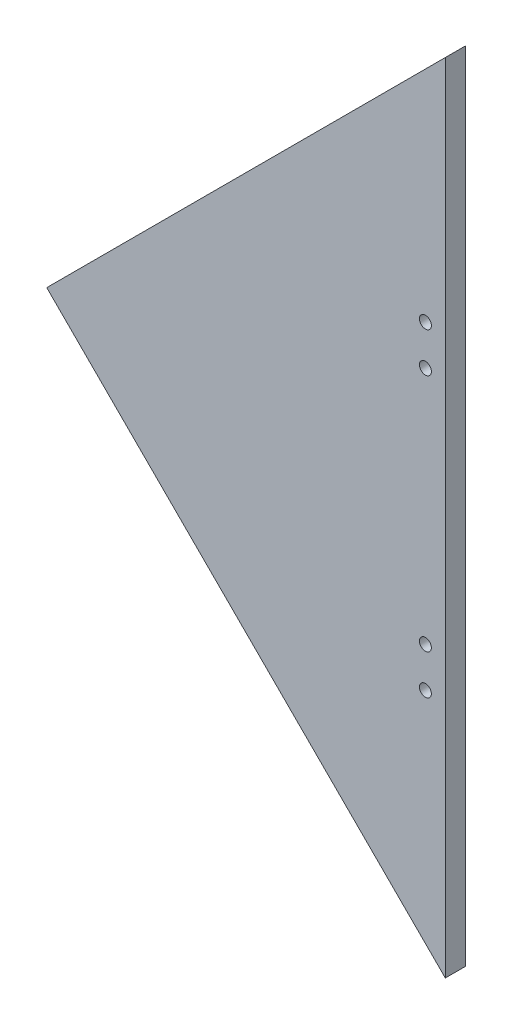
ISO-10303-21;
HEADER;
FILE_DESCRIPTION(('STEP AP214'),'2;1');
FILE_NAME('part.step','',(''),(''),'','','');
FILE_SCHEMA(('AUTOMOTIVE_DESIGN { 1 0 10303 214 1 1 1 1 }'));
ENDSEC;
DATA;
#1=APPLICATION_CONTEXT('core data for automotive mechanical design processes');
#2=APPLICATION_PROTOCOL_DEFINITION('international standard','automotive_design',2000,#1);
#3=PRODUCT_CONTEXT('',#1,'mechanical');
#4=PRODUCT('Part','Part','',(#3));
#5=PRODUCT_RELATED_PRODUCT_CATEGORY('part','',(#4));
#6=PRODUCT_DEFINITION_FORMATION('','',#4);
#7=PRODUCT_DEFINITION_CONTEXT('part definition',#1,'design');
#8=PRODUCT_DEFINITION('design','',#6,#7);
#9=PRODUCT_DEFINITION_SHAPE('','',#8);
#10=(LENGTH_UNIT() NAMED_UNIT(*) SI_UNIT(.MILLI.,.METRE.));
#11=(NAMED_UNIT(*) PLANE_ANGLE_UNIT() SI_UNIT($,.RADIAN.));
#12=(NAMED_UNIT(*) SI_UNIT($,.STERADIAN.) SOLID_ANGLE_UNIT());
#13=UNCERTAINTY_MEASURE_WITH_UNIT(LENGTH_MEASURE(1.E-05),#10,'distance_accuracy_value','');
#14=(GEOMETRIC_REPRESENTATION_CONTEXT(3) GLOBAL_UNCERTAINTY_ASSIGNED_CONTEXT((#13)) GLOBAL_UNIT_ASSIGNED_CONTEXT((#10,
#11,#12)) REPRESENTATION_CONTEXT('',''));
#15=CARTESIAN_POINT('',(0.,0.,0.));
#16=DIRECTION('',(0.,0.,1.));
#17=DIRECTION('',(1.,0.,0.));
#18=AXIS2_PLACEMENT_3D('',#15,#16,#17);
#19=CARTESIAN_POINT('',(0.,0.,5.));
#20=DIRECTION('',(0.,0.,-1.));
#21=DIRECTION('',(-1.,0.,0.));
#22=AXIS2_PLACEMENT_3D('',#19,#20,#21);
#23=PLANE('',#22);
#24=DIRECTION('',(0.707106781186547,-0.707106781186547,0.));
#25=VECTOR('',#24,1.);
#26=CARTESIAN_POINT('',(-100.,0.,5.));
#27=LINE('',#26,#25);
#28=CARTESIAN_POINT('',(-100.,0.,5.));
#29=VERTEX_POINT('',#28);
#30=CARTESIAN_POINT('',(0.,-100.,5.));
#31=VERTEX_POINT('',#30);
#32=EDGE_CURVE('E80',#29,#31,#27,.T.);
#33=ORIENTED_EDGE('',*,*,#32,.T.);
#34=DIRECTION('',(0.,1.,0.));
#35=VECTOR('',#34,1.);
#36=CARTESIAN_POINT('',(0.,-100.,5.));
#37=LINE('',#36,#35);
#38=CARTESIAN_POINT('',(0.,100.,5.));
#39=VERTEX_POINT('',#38);
#40=EDGE_CURVE('E76',#31,#39,#37,.T.);
#41=ORIENTED_EDGE('',*,*,#40,.T.);
#42=DIRECTION('',(-0.707106781186547,-0.707106781186548,0.));
#43=VECTOR('',#42,1.);
#44=CARTESIAN_POINT('',(0.,100.,5.));
#45=LINE('',#44,#43);
#46=EDGE_CURVE('E56',#39,#29,#45,.T.);
#47=ORIENTED_EDGE('',*,*,#46,.T.);
#48=EDGE_LOOP('',(#33,#41,#47));
#49=FACE_BOUND('',#48,.T.);
#50=CARTESIAN_POINT('',(-4.99999999999999,40.,5.));
#51=DIRECTION('',(0.,0.,1.));
#52=DIRECTION('',(1.,0.,0.));
#53=AXIS2_PLACEMENT_3D('',#50,#51,#52);
#54=CIRCLE('',#53,1.5);
#55=CARTESIAN_POINT('',(-3.49999999999999,40.,5.));
#56=VERTEX_POINT('',#55);
#57=EDGE_CURVE('E90',#56,#56,#54,.T.);
#58=ORIENTED_EDGE('',*,*,#57,.F.);
#59=EDGE_LOOP('',(#58));
#60=FACE_BOUND('',#59,.T.);
#61=CARTESIAN_POINT('',(-4.99999999999999,30.,5.));
#62=DIRECTION('',(0.,0.,1.));
#63=DIRECTION('',(1.,0.,0.));
#64=AXIS2_PLACEMENT_3D('',#61,#62,#63);
#65=CIRCLE('',#64,1.5);
#66=CARTESIAN_POINT('',(-3.49999999999999,30.,5.));
#67=VERTEX_POINT('',#66);
#68=EDGE_CURVE('E124',#67,#67,#65,.T.);
#69=ORIENTED_EDGE('',*,*,#68,.F.);
#70=EDGE_LOOP('',(#69));
#71=FACE_BOUND('',#70,.T.);
#72=CARTESIAN_POINT('',(-4.99999999999999,-30.,5.));
#73=DIRECTION('',(0.,0.,1.));
#74=DIRECTION('',(1.,0.,0.));
#75=AXIS2_PLACEMENT_3D('',#72,#73,#74);
#76=CIRCLE('',#75,1.5);
#77=CARTESIAN_POINT('',(-3.49999999999998,-30.,5.));
#78=VERTEX_POINT('',#77);
#79=EDGE_CURVE('E119',#78,#78,#76,.T.);
#80=ORIENTED_EDGE('',*,*,#79,.F.);
#81=EDGE_LOOP('',(#80));
#82=FACE_BOUND('',#81,.T.);
#83=CARTESIAN_POINT('',(-4.99999999999998,-40.,5.));
#84=DIRECTION('',(0.,0.,1.));
#85=DIRECTION('',(1.,0.,0.));
#86=AXIS2_PLACEMENT_3D('',#83,#84,#85);
#87=CIRCLE('',#86,1.5);
#88=CARTESIAN_POINT('',(-3.49999999999998,-40.,5.));
#89=VERTEX_POINT('',#88);
#90=EDGE_CURVE('E113',#89,#89,#87,.T.);
#91=ORIENTED_EDGE('',*,*,#90,.F.);
#92=EDGE_LOOP('',(#91));
#93=FACE_BOUND('',#92,.T.);
#94=ADVANCED_FACE('F39',(#49,#60,#71,#82,#93),#23,.F.);
#95=CARTESIAN_POINT('',(0.,0.,0.));
#96=DIRECTION('',(0.,0.,-1.));
#97=DIRECTION('',(-1.,0.,0.));
#98=AXIS2_PLACEMENT_3D('',#95,#96,#97);
#99=PLANE('',#98);
#100=CARTESIAN_POINT('',(-4.99999999999999,-30.,0.));
#101=DIRECTION('',(0.,0.,1.));
#102=DIRECTION('',(1.,0.,0.));
#103=AXIS2_PLACEMENT_3D('',#100,#101,#102);
#104=CIRCLE('',#103,1.5);
#105=CARTESIAN_POINT('',(-3.49999999999998,-30.,0.));
#106=VERTEX_POINT('',#105);
#107=EDGE_CURVE('E116',#106,#106,#104,.T.);
#108=ORIENTED_EDGE('',*,*,#107,.T.);
#109=EDGE_LOOP('',(#108));
#110=FACE_BOUND('',#109,.T.);
#111=CARTESIAN_POINT('',(-4.99999999999999,40.,0.));
#112=DIRECTION('',(0.,0.,1.));
#113=DIRECTION('',(1.,0.,0.));
#114=AXIS2_PLACEMENT_3D('',#111,#112,#113);
#115=CIRCLE('',#114,1.5);
#116=CARTESIAN_POINT('',(-3.49999999999999,40.,0.));
#117=VERTEX_POINT('',#116);
#118=EDGE_CURVE('E94',#117,#117,#115,.T.);
#119=ORIENTED_EDGE('',*,*,#118,.T.);
#120=EDGE_LOOP('',(#119));
#121=FACE_BOUND('',#120,.T.);
#122=DIRECTION('',(0.707106781186547,-0.707106781186547,0.));
#123=VECTOR('',#122,1.);
#124=CARTESIAN_POINT('',(-100.,0.,0.));
#125=LINE('',#124,#123);
#126=CARTESIAN_POINT('',(-100.,0.,0.));
#127=VERTEX_POINT('',#126);
#128=CARTESIAN_POINT('',(0.,-100.,0.));
#129=VERTEX_POINT('',#128);
#130=EDGE_CURVE('E87',#127,#129,#125,.T.);
#131=ORIENTED_EDGE('',*,*,#130,.F.);
#132=DIRECTION('',(-0.707106781186547,-0.707106781186548,0.));
#133=VECTOR('',#132,1.);
#134=CARTESIAN_POINT('',(0.,100.,0.));
#135=LINE('',#134,#133);
#136=CARTESIAN_POINT('',(0.,100.,0.));
#137=VERTEX_POINT('',#136);
#138=EDGE_CURVE('E73',#137,#127,#135,.T.);
#139=ORIENTED_EDGE('',*,*,#138,.F.);
#140=DIRECTION('',(0.,1.,0.));
#141=VECTOR('',#140,1.);
#142=CARTESIAN_POINT('',(0.,-100.,0.));
#143=LINE('',#142,#141);
#144=EDGE_CURVE('E68',#129,#137,#143,.T.);
#145=ORIENTED_EDGE('',*,*,#144,.F.);
#146=EDGE_LOOP('',(#131,#139,#145));
#147=FACE_BOUND('',#146,.T.);
#148=CARTESIAN_POINT('',(-4.99999999999999,30.,0.));
#149=DIRECTION('',(0.,0.,1.));
#150=DIRECTION('',(1.,0.,0.));
#151=AXIS2_PLACEMENT_3D('',#148,#149,#150);
#152=CIRCLE('',#151,1.5);
#153=CARTESIAN_POINT('',(-3.49999999999999,30.,0.));
#154=VERTEX_POINT('',#153);
#155=EDGE_CURVE('E108',#154,#154,#152,.T.);
#156=ORIENTED_EDGE('',*,*,#155,.T.);
#157=EDGE_LOOP('',(#156));
#158=FACE_BOUND('',#157,.T.);
#159=CARTESIAN_POINT('',(-4.99999999999998,-40.,0.));
#160=DIRECTION('',(0.,0.,1.));
#161=DIRECTION('',(1.,0.,0.));
#162=AXIS2_PLACEMENT_3D('',#159,#160,#161);
#163=CIRCLE('',#162,1.5);
#164=CARTESIAN_POINT('',(-3.49999999999998,-40.,0.));
#165=VERTEX_POINT('',#164);
#166=EDGE_CURVE('E111',#165,#165,#163,.T.);
#167=ORIENTED_EDGE('',*,*,#166,.T.);
#168=EDGE_LOOP('',(#167));
#169=FACE_BOUND('',#168,.T.);
#170=ADVANCED_FACE('F100',(#110,#121,#147,#158,#169),#99,.T.);
#171=CARTESIAN_POINT('',(-100.,0.,5.));
#172=DIRECTION('',(0.707106781186548,0.707106781186548,0.));
#173=DIRECTION('',(-0.707106781186548,0.707106781186548,0.));
#174=AXIS2_PLACEMENT_3D('',#171,#172,#173);
#175=PLANE('',#174);
#176=ORIENTED_EDGE('',*,*,#130,.T.);
#177=DIRECTION('',(0.,0.,-1.));
#178=VECTOR('',#177,1.);
#179=CARTESIAN_POINT('',(0.,-100.,5.));
#180=LINE('',#179,#178);
#181=EDGE_CURVE('E11',#31,#129,#180,.T.);
#182=ORIENTED_EDGE('',*,*,#181,.F.);
#183=ORIENTED_EDGE('',*,*,#32,.F.);
#184=DIRECTION('',(0.,0.,-1.));
#185=VECTOR('',#184,1.);
#186=CARTESIAN_POINT('',(-100.,0.,5.));
#187=LINE('',#186,#185);
#188=EDGE_CURVE('E88',#29,#127,#187,.T.);
#189=ORIENTED_EDGE('',*,*,#188,.T.);
#190=EDGE_LOOP('',(#176,#182,#183,#189));
#191=FACE_BOUND('',#190,.T.);
#192=ADVANCED_FACE('F41',(#191),#175,.F.);
#193=CARTESIAN_POINT('',(0.,-100.,5.));
#194=DIRECTION('',(-1.,0.,0.));
#195=DIRECTION('',(0.,-1.,0.));
#196=AXIS2_PLACEMENT_3D('',#193,#194,#195);
#197=PLANE('',#196);
#198=ORIENTED_EDGE('',*,*,#144,.T.);
#199=DIRECTION('',(0.,0.,-1.));
#200=VECTOR('',#199,1.);
#201=CARTESIAN_POINT('',(0.,100.,5.));
#202=LINE('',#201,#200);
#203=EDGE_CURVE('E48',#39,#137,#202,.T.);
#204=ORIENTED_EDGE('',*,*,#203,.F.);
#205=ORIENTED_EDGE('',*,*,#40,.F.);
#206=ORIENTED_EDGE('',*,*,#181,.T.);
#207=EDGE_LOOP('',(#198,#204,#205,#206));
#208=FACE_BOUND('',#207,.T.);
#209=ADVANCED_FACE('F77',(#208),#197,.F.);
#210=CARTESIAN_POINT('',(0.,100.,5.));
#211=DIRECTION('',(0.707106781186548,-0.707106781186547,0.));
#212=DIRECTION('',(0.707106781186547,0.707106781186548,0.));
#213=AXIS2_PLACEMENT_3D('',#210,#211,#212);
#214=PLANE('',#213);
#215=ORIENTED_EDGE('',*,*,#138,.T.);
#216=ORIENTED_EDGE('',*,*,#188,.F.);
#217=ORIENTED_EDGE('',*,*,#46,.F.);
#218=ORIENTED_EDGE('',*,*,#203,.T.);
#219=EDGE_LOOP('',(#215,#216,#217,#218));
#220=FACE_BOUND('',#219,.T.);
#221=ADVANCED_FACE('F99',(#220),#214,.F.);
#222=CARTESIAN_POINT('',(-4.99999999999999,40.,5.));
#223=DIRECTION('',(0.,0.,-1.));
#224=DIRECTION('',(-1.,0.,0.));
#225=AXIS2_PLACEMENT_3D('',#222,#223,#224);
#226=CYLINDRICAL_SURFACE('',#225,1.5);
#227=ORIENTED_EDGE('',*,*,#57,.T.);
#228=EDGE_LOOP('',(#227));
#229=FACE_BOUND('',#228,.T.);
#230=ORIENTED_EDGE('',*,*,#118,.F.);
#231=EDGE_LOOP('',(#230));
#232=FACE_BOUND('',#231,.T.);
#233=ADVANCED_FACE('F132',(#229,#232),#226,.F.);
#234=CARTESIAN_POINT('',(-4.99999999999999,30.,5.));
#235=DIRECTION('',(0.,0.,-1.));
#236=DIRECTION('',(-1.,0.,0.));
#237=AXIS2_PLACEMENT_3D('',#234,#235,#236);
#238=CYLINDRICAL_SURFACE('',#237,1.5);
#239=ORIENTED_EDGE('',*,*,#68,.T.);
#240=EDGE_LOOP('',(#239));
#241=FACE_BOUND('',#240,.T.);
#242=ORIENTED_EDGE('',*,*,#155,.F.);
#243=EDGE_LOOP('',(#242));
#244=FACE_BOUND('',#243,.T.);
#245=ADVANCED_FACE('F134',(#241,#244),#238,.F.);
#246=CARTESIAN_POINT('',(-4.99999999999999,-30.,5.));
#247=DIRECTION('',(0.,0.,-1.));
#248=DIRECTION('',(-1.,0.,0.));
#249=AXIS2_PLACEMENT_3D('',#246,#247,#248);
#250=CYLINDRICAL_SURFACE('',#249,1.5);
#251=ORIENTED_EDGE('',*,*,#79,.T.);
#252=EDGE_LOOP('',(#251));
#253=FACE_BOUND('',#252,.T.);
#254=ORIENTED_EDGE('',*,*,#107,.F.);
#255=EDGE_LOOP('',(#254));
#256=FACE_BOUND('',#255,.T.);
#257=ADVANCED_FACE('F141',(#253,#256),#250,.F.);
#258=CARTESIAN_POINT('',(-4.99999999999998,-40.,5.));
#259=DIRECTION('',(0.,0.,-1.));
#260=DIRECTION('',(-1.,0.,0.));
#261=AXIS2_PLACEMENT_3D('',#258,#259,#260);
#262=CYLINDRICAL_SURFACE('',#261,1.5);
#263=ORIENTED_EDGE('',*,*,#90,.T.);
#264=EDGE_LOOP('',(#263));
#265=FACE_BOUND('',#264,.T.);
#266=ORIENTED_EDGE('',*,*,#166,.F.);
#267=EDGE_LOOP('',(#266));
#268=FACE_BOUND('',#267,.T.);
#269=ADVANCED_FACE('F192',(#265,#268),#262,.F.);
#270=CLOSED_SHELL('',(#94,#170,#192,#209,#221,#233,#245,#257,#269));
#271=MANIFOLD_SOLID_BREP('B2',#270);
#272=ADVANCED_BREP_SHAPE_REPRESENTATION('',(#18,#271),#14);
#273=SHAPE_DEFINITION_REPRESENTATION(#9,#272);
ENDSEC;
END-ISO-10303-21;
